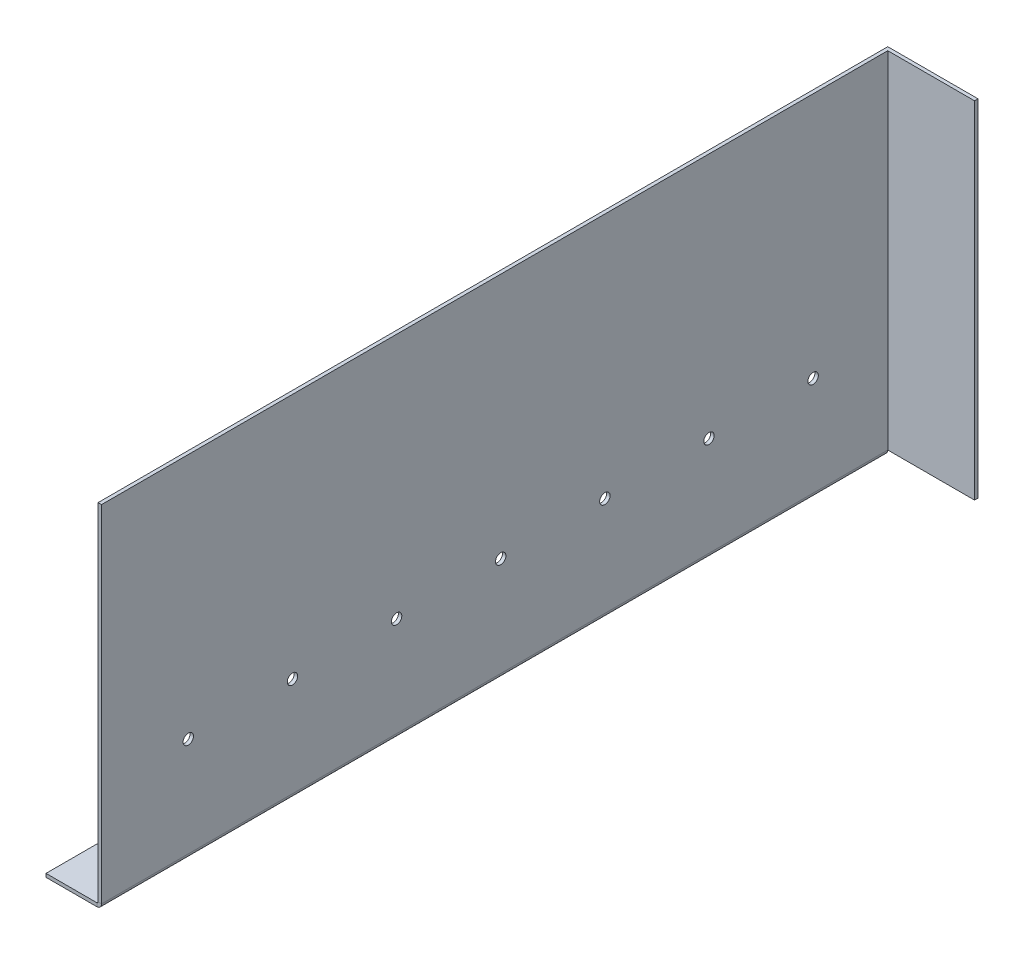
ISO-10303-21;
HEADER;
FILE_DESCRIPTION(('STEP AP214'),'2;1');
FILE_NAME('part.step','',(''),(''),'','','');
FILE_SCHEMA(('AUTOMOTIVE_DESIGN { 1 0 10303 214 1 1 1 1 }'));
ENDSEC;
DATA;
#1=APPLICATION_CONTEXT('core data for automotive mechanical design processes');
#2=APPLICATION_PROTOCOL_DEFINITION('international standard','automotive_design',2000,#1);
#3=PRODUCT_CONTEXT('',#1,'mechanical');
#4=PRODUCT('Part','Part','',(#3));
#5=PRODUCT_RELATED_PRODUCT_CATEGORY('part','',(#4));
#6=PRODUCT_DEFINITION_FORMATION('','',#4);
#7=PRODUCT_DEFINITION_CONTEXT('part definition',#1,'design');
#8=PRODUCT_DEFINITION('design','',#6,#7);
#9=PRODUCT_DEFINITION_SHAPE('','',#8);
#10=(LENGTH_UNIT() NAMED_UNIT(*) SI_UNIT(.MILLI.,.METRE.));
#11=(NAMED_UNIT(*) PLANE_ANGLE_UNIT() SI_UNIT($,.RADIAN.));
#12=(NAMED_UNIT(*) SI_UNIT($,.STERADIAN.) SOLID_ANGLE_UNIT());
#13=UNCERTAINTY_MEASURE_WITH_UNIT(LENGTH_MEASURE(1.E-05),#10,'distance_accuracy_value','');
#14=(GEOMETRIC_REPRESENTATION_CONTEXT(3) GLOBAL_UNCERTAINTY_ASSIGNED_CONTEXT((#13)) GLOBAL_UNIT_ASSIGNED_CONTEXT((#10,
#11,#12)) REPRESENTATION_CONTEXT('',''));
#15=CARTESIAN_POINT('',(0.,0.,0.));
#16=DIRECTION('',(0.,0.,1.));
#17=DIRECTION('',(1.,0.,0.));
#18=AXIS2_PLACEMENT_3D('',#15,#16,#17);
#19=CARTESIAN_POINT('',(29.2634,0.7366,550.));
#20=DIRECTION('',(0.,0.,-1.));
#21=DIRECTION('',(-1.,0.,0.));
#22=AXIS2_PLACEMENT_3D('',#19,#20,#21);
#23=CYLINDRICAL_SURFACE('',#22,0.7366);
#24=DIRECTION('',(0.,0.,-1.));
#25=VECTOR('',#24,1.);
#26=CARTESIAN_POINT('',(30.,0.7366,550.));
#27=LINE('',#26,#25);
#28=CARTESIAN_POINT('',(30.,0.7366,550.));
#29=VERTEX_POINT('',#28);
#30=CARTESIAN_POINT('',(30.,0.736600000000004,97.));
#31=VERTEX_POINT('',#30);
#32=EDGE_CURVE('E159',#29,#31,#27,.T.);
#33=ORIENTED_EDGE('',*,*,#32,.T.);
#34=CARTESIAN_POINT('',(29.2634,0.7366,97.));
#35=DIRECTION('',(0.,0.,1.));
#36=DIRECTION('',(1.,0.,0.));
#37=AXIS2_PLACEMENT_3D('',#34,#35,#36);
#38=CIRCLE('',#37,0.7366);
#39=CARTESIAN_POINT('',(29.2634,0.,97.));
#40=VERTEX_POINT('',#39);
#41=EDGE_CURVE('E143',#40,#31,#38,.T.);
#42=ORIENTED_EDGE('',*,*,#41,.F.);
#43=DIRECTION('',(0.,0.,-1.));
#44=VECTOR('',#43,1.);
#45=CARTESIAN_POINT('',(29.2634,0.,550.));
#46=LINE('',#45,#44);
#47=CARTESIAN_POINT('',(29.2634,0.,550.));
#48=VERTEX_POINT('',#47);
#49=EDGE_CURVE('E151',#48,#40,#46,.T.);
#50=ORIENTED_EDGE('',*,*,#49,.F.);
#51=CARTESIAN_POINT('',(29.2634,0.7366,550.));
#52=DIRECTION('',(0.,0.,-1.));
#53=DIRECTION('',(-1.,0.,0.));
#54=AXIS2_PLACEMENT_3D('',#51,#52,#53);
#55=CIRCLE('',#54,0.7366);
#56=EDGE_CURVE('E206',#48,#29,#55,.F.);
#57=ORIENTED_EDGE('',*,*,#56,.T.);
#58=EDGE_LOOP('',(#33,#42,#50,#57));
#59=FACE_BOUND('',#58,.T.);
#60=ADVANCED_FACE('F39',(#59),#23,.F.);
#61=CARTESIAN_POINT('',(0.,0.,550.));
#62=DIRECTION('',(0.,1.,0.));
#63=DIRECTION('',(0.,0.,1.));
#64=AXIS2_PLACEMENT_3D('',#61,#62,#63);
#65=PLANE('',#64);
#66=ORIENTED_EDGE('',*,*,#49,.T.);
#67=DIRECTION('',(1.,0.,0.));
#68=VECTOR('',#67,1.);
#69=CARTESIAN_POINT('',(14.6317,0.,97.));
#70=LINE('',#69,#68);
#71=CARTESIAN_POINT('',(0.,0.,97.));
#72=VERTEX_POINT('',#71);
#73=EDGE_CURVE('E134',#72,#40,#70,.T.);
#74=ORIENTED_EDGE('',*,*,#73,.F.);
#75=DIRECTION('',(0.,0.,-1.));
#76=VECTOR('',#75,1.);
#77=CARTESIAN_POINT('',(0.,0.,550.));
#78=LINE('',#77,#76);
#79=CARTESIAN_POINT('',(0.,0.,550.));
#80=VERTEX_POINT('',#79);
#81=EDGE_CURVE('E142',#80,#72,#78,.T.);
#82=ORIENTED_EDGE('',*,*,#81,.F.);
#83=DIRECTION('',(1.,0.,0.));
#84=VECTOR('',#83,1.);
#85=CARTESIAN_POINT('',(0.,0.,550.));
#86=LINE('',#85,#84);
#87=EDGE_CURVE('E209',#80,#48,#86,.T.);
#88=ORIENTED_EDGE('',*,*,#87,.T.);
#89=EDGE_LOOP('',(#66,#74,#82,#88));
#90=FACE_BOUND('',#89,.T.);
#91=ADVANCED_FACE('F303',(#90),#65,.T.);
#92=CARTESIAN_POINT('',(0.,-2.,550.));
#93=DIRECTION('',(-1.,0.,0.));
#94=DIRECTION('',(0.,0.,1.));
#95=AXIS2_PLACEMENT_3D('',#92,#93,#94);
#96=PLANE('',#95);
#97=ORIENTED_EDGE('',*,*,#81,.T.);
#98=DIRECTION('',(0.,1.,0.));
#99=VECTOR('',#98,1.);
#100=CARTESIAN_POINT('',(0.,-2.,97.));
#101=LINE('',#100,#99);
#102=CARTESIAN_POINT('',(0.,-2.,97.));
#103=VERTEX_POINT('',#102);
#104=EDGE_CURVE('E126',#72,#103,#101,.F.);
#105=ORIENTED_EDGE('',*,*,#104,.T.);
#106=DIRECTION('',(0.,0.,-1.));
#107=VECTOR('',#106,1.);
#108=CARTESIAN_POINT('',(0.,-2.,550.));
#109=LINE('',#108,#107);
#110=CARTESIAN_POINT('',(0.,-2.,550.));
#111=VERTEX_POINT('',#110);
#112=EDGE_CURVE('E140',#111,#103,#109,.T.);
#113=ORIENTED_EDGE('',*,*,#112,.F.);
#114=DIRECTION('',(0.,1.,0.));
#115=VECTOR('',#114,1.);
#116=CARTESIAN_POINT('',(0.,-2.,550.));
#117=LINE('',#116,#115);
#118=EDGE_CURVE('E212',#111,#80,#117,.T.);
#119=ORIENTED_EDGE('',*,*,#118,.T.);
#120=EDGE_LOOP('',(#97,#105,#113,#119));
#121=FACE_BOUND('',#120,.T.);
#122=ADVANCED_FACE('F138',(#121),#96,.T.);
#123=CARTESIAN_POINT('',(0.,-2.,550.));
#124=DIRECTION('',(0.,1.,0.));
#125=DIRECTION('',(0.,0.,1.));
#126=AXIS2_PLACEMENT_3D('',#123,#124,#125);
#127=PLANE('',#126);
#128=DIRECTION('',(1.,0.,0.));
#129=VECTOR('',#128,1.);
#130=CARTESIAN_POINT('',(0.,-2.,97.));
#131=LINE('',#130,#129);
#132=CARTESIAN_POINT('',(29.2634,-2.,97.));
#133=VERTEX_POINT('',#132);
#134=EDGE_CURVE('E123',#103,#133,#131,.T.);
#135=ORIENTED_EDGE('',*,*,#134,.T.);
#136=DIRECTION('',(0.,0.,-1.));
#137=VECTOR('',#136,1.);
#138=CARTESIAN_POINT('',(29.2634,-2.,550.));
#139=LINE('',#138,#137);
#140=CARTESIAN_POINT('',(29.2634,-2.,550.));
#141=VERTEX_POINT('',#140);
#142=EDGE_CURVE('E149',#141,#133,#139,.T.);
#143=ORIENTED_EDGE('',*,*,#142,.F.);
#144=DIRECTION('',(1.,0.,0.));
#145=VECTOR('',#144,1.);
#146=CARTESIAN_POINT('',(0.,-2.,550.));
#147=LINE('',#146,#145);
#148=EDGE_CURVE('E147',#111,#141,#147,.T.);
#149=ORIENTED_EDGE('',*,*,#148,.F.);
#150=ORIENTED_EDGE('',*,*,#112,.T.);
#151=EDGE_LOOP('',(#135,#143,#149,#150));
#152=FACE_BOUND('',#151,.T.);
#153=ADVANCED_FACE('F145',(#152),#127,.F.);
#154=CARTESIAN_POINT('',(29.2634,0.7366,550.));
#155=DIRECTION('',(0.,0.,-1.));
#156=DIRECTION('',(-1.,0.,0.));
#157=AXIS2_PLACEMENT_3D('',#154,#155,#156);
#158=CYLINDRICAL_SURFACE('',#157,2.7366);
#159=CARTESIAN_POINT('',(29.2634,0.7366,97.));
#160=DIRECTION('',(0.,0.,-1.));
#161=DIRECTION('',(-1.,0.,0.));
#162=AXIS2_PLACEMENT_3D('',#159,#160,#161);
#163=CIRCLE('',#162,2.7366);
#164=CARTESIAN_POINT('',(32.,0.736599999999453,97.));
#165=VERTEX_POINT('',#164);
#166=EDGE_CURVE('E333',#133,#165,#163,.F.);
#167=ORIENTED_EDGE('',*,*,#166,.T.);
#168=DIRECTION('',(0.,0.,-1.));
#169=VECTOR('',#168,1.);
#170=CARTESIAN_POINT('',(32.,0.7366,550.));
#171=LINE('',#170,#169);
#172=CARTESIAN_POINT('',(32.,0.7366,550.));
#173=VERTEX_POINT('',#172);
#174=EDGE_CURVE('E153',#173,#165,#171,.T.);
#175=ORIENTED_EDGE('',*,*,#174,.F.);
#176=CARTESIAN_POINT('',(29.2634,0.7366,550.));
#177=DIRECTION('',(0.,0.,1.));
#178=DIRECTION('',(1.,0.,0.));
#179=AXIS2_PLACEMENT_3D('',#176,#177,#178);
#180=CIRCLE('',#179,2.7366);
#181=EDGE_CURVE('E215',#141,#173,#180,.T.);
#182=ORIENTED_EDGE('',*,*,#181,.F.);
#183=ORIENTED_EDGE('',*,*,#142,.T.);
#184=EDGE_LOOP('',(#167,#175,#182,#183));
#185=FACE_BOUND('',#184,.T.);
#186=ADVANCED_FACE('F276',(#185),#158,.T.);
#187=CARTESIAN_POINT('',(32.,0.,550.));
#188=DIRECTION('',(-1.,0.,0.));
#189=DIRECTION('',(0.,0.,1.));
#190=AXIS2_PLACEMENT_3D('',#187,#188,#189);
#191=PLANE('',#190);
#192=CARTESIAN_POINT('',(32.,58.,140.));
#193=DIRECTION('',(1.,0.,0.));
#194=DIRECTION('',(0.,0.,-1.));
#195=AXIS2_PLACEMENT_3D('',#192,#193,#194);
#196=CIRCLE('',#195,2.99999999999999);
#197=CARTESIAN_POINT('',(32.,58.,137.));
#198=VERTEX_POINT('',#197);
#199=EDGE_CURVE('E201',#198,#198,#196,.T.);
#200=ORIENTED_EDGE('',*,*,#199,.F.);
#201=EDGE_LOOP('',(#200));
#202=FACE_BOUND('',#201,.T.);
#203=CARTESIAN_POINT('',(32.,58.,200.));
#204=DIRECTION('',(1.,0.,0.));
#205=DIRECTION('',(0.,0.,-1.));
#206=AXIS2_PLACEMENT_3D('',#203,#204,#205);
#207=CIRCLE('',#206,2.99999999999999);
#208=CARTESIAN_POINT('',(32.,58.,197.));
#209=VERTEX_POINT('',#208);
#210=EDGE_CURVE('E264',#209,#209,#207,.T.);
#211=ORIENTED_EDGE('',*,*,#210,.F.);
#212=EDGE_LOOP('',(#211));
#213=FACE_BOUND('',#212,.T.);
#214=CARTESIAN_POINT('',(32.,58.,260.));
#215=DIRECTION('',(1.,0.,0.));
#216=DIRECTION('',(0.,0.,-1.));
#217=AXIS2_PLACEMENT_3D('',#214,#215,#216);
#218=CIRCLE('',#217,2.99999999999999);
#219=CARTESIAN_POINT('',(32.,58.,257.));
#220=VERTEX_POINT('',#219);
#221=EDGE_CURVE('E262',#220,#220,#218,.T.);
#222=ORIENTED_EDGE('',*,*,#221,.F.);
#223=EDGE_LOOP('',(#222));
#224=FACE_BOUND('',#223,.T.);
#225=CARTESIAN_POINT('',(32.,58.,320.));
#226=DIRECTION('',(1.,0.,0.));
#227=DIRECTION('',(0.,0.,-1.));
#228=AXIS2_PLACEMENT_3D('',#225,#226,#227);
#229=CIRCLE('',#228,2.99999999999999);
#230=CARTESIAN_POINT('',(32.,58.,317.));
#231=VERTEX_POINT('',#230);
#232=EDGE_CURVE('E259',#231,#231,#229,.T.);
#233=ORIENTED_EDGE('',*,*,#232,.F.);
#234=EDGE_LOOP('',(#233));
#235=FACE_BOUND('',#234,.T.);
#236=CARTESIAN_POINT('',(32.,58.,380.));
#237=DIRECTION('',(1.,0.,0.));
#238=DIRECTION('',(0.,0.,-1.));
#239=AXIS2_PLACEMENT_3D('',#236,#237,#238);
#240=CIRCLE('',#239,2.99999999999999);
#241=CARTESIAN_POINT('',(32.,58.,377.));
#242=VERTEX_POINT('',#241);
#243=EDGE_CURVE('E256',#242,#242,#240,.T.);
#244=ORIENTED_EDGE('',*,*,#243,.F.);
#245=EDGE_LOOP('',(#244));
#246=FACE_BOUND('',#245,.T.);
#247=CARTESIAN_POINT('',(32.,58.,440.));
#248=DIRECTION('',(1.,0.,0.));
#249=DIRECTION('',(0.,0.,-1.));
#250=AXIS2_PLACEMENT_3D('',#247,#248,#249);
#251=CIRCLE('',#250,2.99999999999999);
#252=CARTESIAN_POINT('',(32.,58.,437.));
#253=VERTEX_POINT('',#252);
#254=EDGE_CURVE('E253',#253,#253,#251,.T.);
#255=ORIENTED_EDGE('',*,*,#254,.F.);
#256=EDGE_LOOP('',(#255));
#257=FACE_BOUND('',#256,.T.);
#258=CARTESIAN_POINT('',(32.,58.,500.));
#259=DIRECTION('',(1.,0.,0.));
#260=DIRECTION('',(0.,0.,-1.));
#261=AXIS2_PLACEMENT_3D('',#258,#259,#260);
#262=CIRCLE('',#261,2.99999999999999);
#263=CARTESIAN_POINT('',(32.,58.,497.));
#264=VERTEX_POINT('',#263);
#265=EDGE_CURVE('E174',#264,#264,#262,.T.);
#266=ORIENTED_EDGE('',*,*,#265,.F.);
#267=EDGE_LOOP('',(#266));
#268=FACE_BOUND('',#267,.T.);
#269=DIRECTION('',(0.,-1.,0.));
#270=VECTOR('',#269,1.);
#271=CARTESIAN_POINT('',(32.,200.,97.));
#272=LINE('',#271,#270);
#273=CARTESIAN_POINT('',(32.,200.,97.));
#274=VERTEX_POINT('',#273);
#275=EDGE_CURVE('E54',#274,#165,#272,.T.);
#276=ORIENTED_EDGE('',*,*,#275,.F.);
#277=DIRECTION('',(0.,0.,-1.));
#278=VECTOR('',#277,1.);
#279=CARTESIAN_POINT('',(32.,200.,550.));
#280=LINE('',#279,#278);
#281=CARTESIAN_POINT('',(32.,200.,550.));
#282=VERTEX_POINT('',#281);
#283=EDGE_CURVE('E165',#282,#274,#280,.T.);
#284=ORIENTED_EDGE('',*,*,#283,.F.);
#285=DIRECTION('',(0.,1.,0.));
#286=VECTOR('',#285,1.);
#287=CARTESIAN_POINT('',(32.,0.,550.));
#288=LINE('',#287,#286);
#289=EDGE_CURVE('E190',#173,#282,#288,.T.);
#290=ORIENTED_EDGE('',*,*,#289,.F.);
#291=ORIENTED_EDGE('',*,*,#174,.T.);
#292=EDGE_LOOP('',(#276,#284,#290,#291));
#293=FACE_BOUND('',#292,.T.);
#294=ADVANCED_FACE('F217',(#202,#213,#224,#235,#246,#257,#268,#293),#191,.F.);
#295=CARTESIAN_POINT('',(32.,200.,95.));
#296=DIRECTION('',(0.,0.,1.));
#297=DIRECTION('',(0.,-1.,0.));
#298=AXIS2_PLACEMENT_3D('',#295,#296,#297);
#299=PLANE('',#298);
#300=DIRECTION('',(-1.,0.,0.));
#301=VECTOR('',#300,1.);
#302=CARTESIAN_POINT('',(32.,200.,95.));
#303=LINE('',#302,#301);
#304=CARTESIAN_POINT('',(82.,200.,95.));
#305=VERTEX_POINT('',#304);
#306=CARTESIAN_POINT('',(30.,200.,95.));
#307=VERTEX_POINT('',#306);
#308=EDGE_CURVE('E242',#305,#307,#303,.T.);
#309=ORIENTED_EDGE('',*,*,#308,.F.);
#310=DIRECTION('',(0.,1.,0.));
#311=VECTOR('',#310,1.);
#312=CARTESIAN_POINT('',(82.,200.,95.));
#313=LINE('',#312,#311);
#314=CARTESIAN_POINT('',(82.,0.736600000000001,95.));
#315=VERTEX_POINT('',#314);
#316=EDGE_CURVE('E597',#315,#305,#313,.T.);
#317=ORIENTED_EDGE('',*,*,#316,.F.);
#318=DIRECTION('',(-1.,0.,0.));
#319=VECTOR('',#318,1.);
#320=CARTESIAN_POINT('',(82.,0.736600000000001,95.));
#321=LINE('',#320,#319);
#322=CARTESIAN_POINT('',(32.,0.736600000000001,95.));
#323=VERTEX_POINT('',#322);
#324=EDGE_CURVE('E240',#315,#323,#321,.T.);
#325=ORIENTED_EDGE('',*,*,#324,.T.);
#326=DIRECTION('',(-1.,0.,0.));
#327=VECTOR('',#326,1.);
#328=CARTESIAN_POINT('',(32.,0.7366,95.));
#329=LINE('',#328,#327);
#330=CARTESIAN_POINT('',(30.,0.736600000000004,95.));
#331=VERTEX_POINT('',#330);
#332=EDGE_CURVE('E11',#323,#331,#329,.T.);
#333=ORIENTED_EDGE('',*,*,#332,.T.);
#334=DIRECTION('',(0.,1.,0.));
#335=VECTOR('',#334,1.);
#336=CARTESIAN_POINT('',(30.,0.,95.));
#337=LINE('',#336,#335);
#338=EDGE_CURVE('E249',#331,#307,#337,.T.);
#339=ORIENTED_EDGE('',*,*,#338,.T.);
#340=EDGE_LOOP('',(#309,#317,#325,#333,#339));
#341=FACE_BOUND('',#340,.T.);
#342=ADVANCED_FACE('F275',(#341),#299,.F.);
#343=CARTESIAN_POINT('',(30.,0.7366,550.));
#344=DIRECTION('',(0.,0.,1.));
#345=DIRECTION('',(1.,0.,0.));
#346=AXIS2_PLACEMENT_3D('',#343,#344,#345);
#347=PLANE('',#346);
#348=DIRECTION('',(1.,0.,0.));
#349=VECTOR('',#348,1.);
#350=CARTESIAN_POINT('',(30.,0.7366,550.));
#351=LINE('',#350,#349);
#352=EDGE_CURVE('E47',#29,#173,#351,.T.);
#353=ORIENTED_EDGE('',*,*,#352,.F.);
#354=ORIENTED_EDGE('',*,*,#56,.F.);
#355=DIRECTION('',(0.,1.,0.));
#356=VECTOR('',#355,1.);
#357=CARTESIAN_POINT('',(29.2634,-2.,550.));
#358=LINE('',#357,#356);
#359=EDGE_CURVE('E167',#141,#48,#358,.T.);
#360=ORIENTED_EDGE('',*,*,#359,.F.);
#361=ORIENTED_EDGE('',*,*,#181,.T.);
#362=EDGE_LOOP('',(#353,#354,#360,#361));
#363=FACE_BOUND('',#362,.T.);
#364=ADVANCED_FACE('F41',(#363),#347,.T.);
#365=CARTESIAN_POINT('',(29.2634,-2.,550.));
#366=DIRECTION('',(0.,0.,1.));
#367=DIRECTION('',(1.,0.,0.));
#368=AXIS2_PLACEMENT_3D('',#365,#366,#367);
#369=PLANE('',#368);
#370=DIRECTION('',(0.,1.,0.));
#371=VECTOR('',#370,1.);
#372=CARTESIAN_POINT('',(30.,0.,550.));
#373=LINE('',#372,#371);
#374=CARTESIAN_POINT('',(30.,200.,550.));
#375=VERTEX_POINT('',#374);
#376=EDGE_CURVE('E198',#29,#375,#373,.T.);
#377=ORIENTED_EDGE('',*,*,#376,.F.);
#378=ORIENTED_EDGE('',*,*,#352,.T.);
#379=ORIENTED_EDGE('',*,*,#289,.T.);
#380=DIRECTION('',(1.,0.,0.));
#381=VECTOR('',#380,1.);
#382=CARTESIAN_POINT('',(30.,200.,550.));
#383=LINE('',#382,#381);
#384=EDGE_CURVE('E193',#375,#282,#383,.T.);
#385=ORIENTED_EDGE('',*,*,#384,.F.);
#386=EDGE_LOOP('',(#377,#378,#379,#385));
#387=FACE_BOUND('',#386,.T.);
#388=ADVANCED_FACE('F320',(#387),#369,.T.);
#389=CARTESIAN_POINT('',(30.,200.,550.));
#390=DIRECTION('',(0.,1.,0.));
#391=DIRECTION('',(0.,0.,1.));
#392=AXIS2_PLACEMENT_3D('',#389,#390,#391);
#393=PLANE('',#392);
#394=ORIENTED_EDGE('',*,*,#308,.T.);
#395=DIRECTION('',(0.,0.,-1.));
#396=VECTOR('',#395,1.);
#397=CARTESIAN_POINT('',(30.,200.,550.));
#398=LINE('',#397,#396);
#399=EDGE_CURVE('E162',#375,#307,#398,.T.);
#400=ORIENTED_EDGE('',*,*,#399,.F.);
#401=ORIENTED_EDGE('',*,*,#384,.T.);
#402=ORIENTED_EDGE('',*,*,#283,.T.);
#403=DIRECTION('',(-1.,0.,0.));
#404=VECTOR('',#403,1.);
#405=CARTESIAN_POINT('',(82.,200.,97.));
#406=LINE('',#405,#404);
#407=CARTESIAN_POINT('',(82.,200.,97.));
#408=VERTEX_POINT('',#407);
#409=EDGE_CURVE('E230',#408,#274,#406,.T.);
#410=ORIENTED_EDGE('',*,*,#409,.F.);
#411=DIRECTION('',(0.,0.,1.));
#412=VECTOR('',#411,1.);
#413=CARTESIAN_POINT('',(82.,200.,95.));
#414=LINE('',#413,#412);
#415=EDGE_CURVE('E599',#305,#408,#414,.T.);
#416=ORIENTED_EDGE('',*,*,#415,.F.);
#417=EDGE_LOOP('',(#394,#400,#401,#402,#410,#416));
#418=FACE_BOUND('',#417,.T.);
#419=ADVANCED_FACE('F317',(#418),#393,.T.);
#420=CARTESIAN_POINT('',(30.,0.,550.));
#421=DIRECTION('',(-1.,0.,0.));
#422=DIRECTION('',(0.,0.,1.));
#423=AXIS2_PLACEMENT_3D('',#420,#421,#422);
#424=PLANE('',#423);
#425=ORIENTED_EDGE('',*,*,#338,.F.);
#426=DIRECTION('',(0.,0.,-1.));
#427=VECTOR('',#426,1.);
#428=CARTESIAN_POINT('',(30.,0.736599999999853,550.));
#429=LINE('',#428,#427);
#430=EDGE_CURVE('E609',#31,#331,#429,.T.);
#431=ORIENTED_EDGE('',*,*,#430,.F.);
#432=ORIENTED_EDGE('',*,*,#32,.F.);
#433=ORIENTED_EDGE('',*,*,#376,.T.);
#434=ORIENTED_EDGE('',*,*,#399,.T.);
#435=EDGE_LOOP('',(#425,#431,#432,#433,#434));
#436=FACE_BOUND('',#435,.T.);
#437=CARTESIAN_POINT('',(30.,58.,500.));
#438=DIRECTION('',(-1.,0.,0.));
#439=DIRECTION('',(0.,0.,1.));
#440=AXIS2_PLACEMENT_3D('',#437,#438,#439);
#441=CIRCLE('',#440,2.99999999999999);
#442=CARTESIAN_POINT('',(30.,58.,503.));
#443=VERTEX_POINT('',#442);
#444=EDGE_CURVE('E188',#443,#443,#441,.T.);
#445=ORIENTED_EDGE('',*,*,#444,.F.);
#446=EDGE_LOOP('',(#445));
#447=FACE_BOUND('',#446,.T.);
#448=CARTESIAN_POINT('',(30.,58.,440.));
#449=DIRECTION('',(-1.,0.,0.));
#450=DIRECTION('',(0.,0.,1.));
#451=AXIS2_PLACEMENT_3D('',#448,#449,#450);
#452=CIRCLE('',#451,2.99999999999999);
#453=CARTESIAN_POINT('',(30.,58.,443.));
#454=VERTEX_POINT('',#453);
#455=EDGE_CURVE('E186',#454,#454,#452,.T.);
#456=ORIENTED_EDGE('',*,*,#455,.F.);
#457=EDGE_LOOP('',(#456));
#458=FACE_BOUND('',#457,.T.);
#459=CARTESIAN_POINT('',(30.,58.,380.));
#460=DIRECTION('',(-1.,0.,0.));
#461=DIRECTION('',(0.,0.,1.));
#462=AXIS2_PLACEMENT_3D('',#459,#460,#461);
#463=CIRCLE('',#462,2.99999999999999);
#464=CARTESIAN_POINT('',(30.,58.,383.));
#465=VERTEX_POINT('',#464);
#466=EDGE_CURVE('E183',#465,#465,#463,.T.);
#467=ORIENTED_EDGE('',*,*,#466,.F.);
#468=EDGE_LOOP('',(#467));
#469=FACE_BOUND('',#468,.T.);
#470=CARTESIAN_POINT('',(30.,58.,320.));
#471=DIRECTION('',(-1.,0.,0.));
#472=DIRECTION('',(0.,0.,1.));
#473=AXIS2_PLACEMENT_3D('',#470,#471,#472);
#474=CIRCLE('',#473,2.99999999999999);
#475=CARTESIAN_POINT('',(30.,58.,323.));
#476=VERTEX_POINT('',#475);
#477=EDGE_CURVE('E180',#476,#476,#474,.T.);
#478=ORIENTED_EDGE('',*,*,#477,.F.);
#479=EDGE_LOOP('',(#478));
#480=FACE_BOUND('',#479,.T.);
#481=CARTESIAN_POINT('',(30.,58.,260.));
#482=DIRECTION('',(-1.,0.,0.));
#483=DIRECTION('',(0.,0.,1.));
#484=AXIS2_PLACEMENT_3D('',#481,#482,#483);
#485=CIRCLE('',#484,2.99999999999999);
#486=CARTESIAN_POINT('',(30.,58.,263.));
#487=VERTEX_POINT('',#486);
#488=EDGE_CURVE('E177',#487,#487,#485,.T.);
#489=ORIENTED_EDGE('',*,*,#488,.F.);
#490=EDGE_LOOP('',(#489));
#491=FACE_BOUND('',#490,.T.);
#492=CARTESIAN_POINT('',(30.,58.,200.));
#493=DIRECTION('',(-1.,0.,0.));
#494=DIRECTION('',(0.,0.,1.));
#495=AXIS2_PLACEMENT_3D('',#492,#493,#494);
#496=CIRCLE('',#495,2.99999999999999);
#497=CARTESIAN_POINT('',(30.,58.,203.));
#498=VERTEX_POINT('',#497);
#499=EDGE_CURVE('E173',#498,#498,#496,.T.);
#500=ORIENTED_EDGE('',*,*,#499,.F.);
#501=EDGE_LOOP('',(#500));
#502=FACE_BOUND('',#501,.T.);
#503=CARTESIAN_POINT('',(30.,58.,140.));
#504=DIRECTION('',(-1.,0.,0.));
#505=DIRECTION('',(0.,0.,1.));
#506=AXIS2_PLACEMENT_3D('',#503,#504,#505);
#507=CIRCLE('',#506,2.99999999999999);
#508=CARTESIAN_POINT('',(30.,58.,143.));
#509=VERTEX_POINT('',#508);
#510=EDGE_CURVE('E170',#509,#509,#507,.T.);
#511=ORIENTED_EDGE('',*,*,#510,.F.);
#512=EDGE_LOOP('',(#511));
#513=FACE_BOUND('',#512,.T.);
#514=ADVANCED_FACE('F313',(#436,#447,#458,#469,#480,#491,#502,#513),#424,.T.);
#515=CARTESIAN_POINT('',(29.2634,0.7366,550.));
#516=DIRECTION('',(0.,0.,-1.));
#517=DIRECTION('',(-1.,0.,0.));
#518=AXIS2_PLACEMENT_3D('',#515,#516,#517);
#519=PLANE('',#518);
#520=ORIENTED_EDGE('',*,*,#148,.T.);
#521=ORIENTED_EDGE('',*,*,#359,.T.);
#522=ORIENTED_EDGE('',*,*,#87,.F.);
#523=ORIENTED_EDGE('',*,*,#118,.F.);
#524=EDGE_LOOP('',(#520,#521,#522,#523));
#525=FACE_BOUND('',#524,.T.);
#526=ADVANCED_FACE('F316',(#525),#519,.F.);
#527=CARTESIAN_POINT('',(22.,58.,140.));
#528=DIRECTION('',(1.,0.,0.));
#529=DIRECTION('',(0.,0.,-1.));
#530=AXIS2_PLACEMENT_3D('',#527,#528,#529);
#531=CYLINDRICAL_SURFACE('',#530,2.99999999999999);
#532=ORIENTED_EDGE('',*,*,#510,.T.);
#533=EDGE_LOOP('',(#532));
#534=FACE_BOUND('',#533,.T.);
#535=ORIENTED_EDGE('',*,*,#199,.T.);
#536=EDGE_LOOP('',(#535));
#537=FACE_BOUND('',#536,.T.);
#538=ADVANCED_FACE('F271',(#534,#537),#531,.F.);
#539=CARTESIAN_POINT('',(22.,58.,200.));
#540=DIRECTION('',(1.,0.,0.));
#541=DIRECTION('',(0.,0.,-1.));
#542=AXIS2_PLACEMENT_3D('',#539,#540,#541);
#543=CYLINDRICAL_SURFACE('',#542,2.99999999999999);
#544=ORIENTED_EDGE('',*,*,#499,.T.);
#545=EDGE_LOOP('',(#544));
#546=FACE_BOUND('',#545,.T.);
#547=ORIENTED_EDGE('',*,*,#210,.T.);
#548=EDGE_LOOP('',(#547));
#549=FACE_BOUND('',#548,.T.);
#550=ADVANCED_FACE('F517',(#546,#549),#543,.F.);
#551=CARTESIAN_POINT('',(22.,58.,260.));
#552=DIRECTION('',(1.,0.,0.));
#553=DIRECTION('',(0.,0.,-1.));
#554=AXIS2_PLACEMENT_3D('',#551,#552,#553);
#555=CYLINDRICAL_SURFACE('',#554,2.99999999999999);
#556=ORIENTED_EDGE('',*,*,#488,.T.);
#557=EDGE_LOOP('',(#556));
#558=FACE_BOUND('',#557,.T.);
#559=ORIENTED_EDGE('',*,*,#221,.T.);
#560=EDGE_LOOP('',(#559));
#561=FACE_BOUND('',#560,.T.);
#562=ADVANCED_FACE('F506',(#558,#561),#555,.F.);
#563=CARTESIAN_POINT('',(22.,58.,320.));
#564=DIRECTION('',(1.,0.,0.));
#565=DIRECTION('',(0.,0.,-1.));
#566=AXIS2_PLACEMENT_3D('',#563,#564,#565);
#567=CYLINDRICAL_SURFACE('',#566,2.99999999999999);
#568=ORIENTED_EDGE('',*,*,#477,.T.);
#569=EDGE_LOOP('',(#568));
#570=FACE_BOUND('',#569,.T.);
#571=ORIENTED_EDGE('',*,*,#232,.T.);
#572=EDGE_LOOP('',(#571));
#573=FACE_BOUND('',#572,.T.);
#574=ADVANCED_FACE('F495',(#570,#573),#567,.F.);
#575=CARTESIAN_POINT('',(22.,58.,380.));
#576=DIRECTION('',(1.,0.,0.));
#577=DIRECTION('',(0.,0.,-1.));
#578=AXIS2_PLACEMENT_3D('',#575,#576,#577);
#579=CYLINDRICAL_SURFACE('',#578,2.99999999999999);
#580=ORIENTED_EDGE('',*,*,#466,.T.);
#581=EDGE_LOOP('',(#580));
#582=FACE_BOUND('',#581,.T.);
#583=ORIENTED_EDGE('',*,*,#243,.T.);
#584=EDGE_LOOP('',(#583));
#585=FACE_BOUND('',#584,.T.);
#586=ADVANCED_FACE('F298',(#582,#585),#579,.F.);
#587=CARTESIAN_POINT('',(22.,58.,440.));
#588=DIRECTION('',(1.,0.,0.));
#589=DIRECTION('',(0.,0.,-1.));
#590=AXIS2_PLACEMENT_3D('',#587,#588,#589);
#591=CYLINDRICAL_SURFACE('',#590,2.99999999999999);
#592=ORIENTED_EDGE('',*,*,#455,.T.);
#593=EDGE_LOOP('',(#592));
#594=FACE_BOUND('',#593,.T.);
#595=ORIENTED_EDGE('',*,*,#254,.T.);
#596=EDGE_LOOP('',(#595));
#597=FACE_BOUND('',#596,.T.);
#598=ADVANCED_FACE('F291',(#594,#597),#591,.F.);
#599=CARTESIAN_POINT('',(22.,58.,500.));
#600=DIRECTION('',(1.,0.,0.));
#601=DIRECTION('',(0.,0.,-1.));
#602=AXIS2_PLACEMENT_3D('',#599,#600,#601);
#603=CYLINDRICAL_SURFACE('',#602,2.99999999999999);
#604=ORIENTED_EDGE('',*,*,#444,.T.);
#605=EDGE_LOOP('',(#604));
#606=FACE_BOUND('',#605,.T.);
#607=ORIENTED_EDGE('',*,*,#265,.T.);
#608=EDGE_LOOP('',(#607));
#609=FACE_BOUND('',#608,.T.);
#610=ADVANCED_FACE('F289',(#606,#609),#603,.F.);
#611=CARTESIAN_POINT('',(82.,200.,97.));
#612=DIRECTION('',(0.,0.,-1.));
#613=DIRECTION('',(0.,1.,0.));
#614=AXIS2_PLACEMENT_3D('',#611,#612,#613);
#615=PLANE('',#614);
#616=ORIENTED_EDGE('',*,*,#275,.T.);
#617=DIRECTION('',(-1.,0.,0.));
#618=VECTOR('',#617,1.);
#619=CARTESIAN_POINT('',(82.,0.7366,97.));
#620=LINE('',#619,#618);
#621=CARTESIAN_POINT('',(82.,0.7366,97.));
#622=VERTEX_POINT('',#621);
#623=EDGE_CURVE('E227',#622,#165,#620,.T.);
#624=ORIENTED_EDGE('',*,*,#623,.F.);
#625=DIRECTION('',(0.,-1.,0.));
#626=VECTOR('',#625,1.);
#627=CARTESIAN_POINT('',(82.,200.,97.));
#628=LINE('',#627,#626);
#629=EDGE_CURVE('E601',#408,#622,#628,.T.);
#630=ORIENTED_EDGE('',*,*,#629,.F.);
#631=ORIENTED_EDGE('',*,*,#409,.T.);
#632=EDGE_LOOP('',(#616,#624,#630,#631));
#633=FACE_BOUND('',#632,.T.);
#634=ADVANCED_FACE('F225',(#633),#615,.F.);
#635=CARTESIAN_POINT('',(82.,0.736600000000001,95.));
#636=DIRECTION('',(0.,1.,0.));
#637=DIRECTION('',(0.,0.,1.));
#638=AXIS2_PLACEMENT_3D('',#635,#636,#637);
#639=PLANE('',#638);
#640=DIRECTION('',(0.,0.,-1.));
#641=VECTOR('',#640,1.);
#642=CARTESIAN_POINT('',(32.,0.736600000000001,95.));
#643=LINE('',#642,#641);
#644=EDGE_CURVE('E231',#165,#323,#643,.T.);
#645=ORIENTED_EDGE('',*,*,#644,.T.);
#646=ORIENTED_EDGE('',*,*,#324,.F.);
#647=DIRECTION('',(0.,0.,-1.));
#648=VECTOR('',#647,1.);
#649=CARTESIAN_POINT('',(82.,0.736600000000001,95.));
#650=LINE('',#649,#648);
#651=EDGE_CURVE('E239',#622,#315,#650,.T.);
#652=ORIENTED_EDGE('',*,*,#651,.F.);
#653=ORIENTED_EDGE('',*,*,#623,.T.);
#654=EDGE_LOOP('',(#645,#646,#652,#653));
#655=FACE_BOUND('',#654,.T.);
#656=ADVANCED_FACE('F236',(#655),#639,.F.);
#657=CARTESIAN_POINT('',(82.,0.,0.));
#658=DIRECTION('',(-1.,0.,0.));
#659=DIRECTION('',(0.,0.,1.));
#660=AXIS2_PLACEMENT_3D('',#657,#658,#659);
#661=PLANE('',#660);
#662=ORIENTED_EDGE('',*,*,#316,.T.);
#663=ORIENTED_EDGE('',*,*,#415,.T.);
#664=ORIENTED_EDGE('',*,*,#629,.T.);
#665=ORIENTED_EDGE('',*,*,#651,.T.);
#666=EDGE_LOOP('',(#662,#663,#664,#665));
#667=FACE_BOUND('',#666,.T.);
#668=ADVANCED_FACE('F397',(#667),#661,.F.);
#669=CARTESIAN_POINT('',(30.,0.736599999999853,96.));
#670=DIRECTION('',(-2.00031326691257E-13,-1.,0.));
#671=DIRECTION('',(0.,0.,-1.));
#672=AXIS2_PLACEMENT_3D('',#669,#670,#671);
#673=PLANE('',#672);
#674=DIRECTION('',(-1.,0.,0.));
#675=VECTOR('',#674,1.);
#676=CARTESIAN_POINT('',(30.,0.736600000000004,97.));
#677=LINE('',#676,#675);
#678=EDGE_CURVE('E232',#31,#165,#677,.F.);
#679=ORIENTED_EDGE('',*,*,#678,.F.);
#680=ORIENTED_EDGE('',*,*,#430,.T.);
#681=ORIENTED_EDGE('',*,*,#332,.F.);
#682=ORIENTED_EDGE('',*,*,#644,.F.);
#683=EDGE_LOOP('',(#679,#680,#681,#682));
#684=FACE_BOUND('',#683,.T.);
#685=ADVANCED_FACE('F404',(#684),#673,.T.);
#686=CARTESIAN_POINT('',(29.2634,0.7366,97.));
#687=DIRECTION('',(0.,0.,-1.));
#688=DIRECTION('',(-1.,0.,0.));
#689=AXIS2_PLACEMENT_3D('',#686,#687,#688);
#690=PLANE('',#689);
#691=ORIENTED_EDGE('',*,*,#41,.T.);
#692=ORIENTED_EDGE('',*,*,#678,.T.);
#693=ORIENTED_EDGE('',*,*,#166,.F.);
#694=DIRECTION('',(0.,1.,0.));
#695=VECTOR('',#694,1.);
#696=CARTESIAN_POINT('',(29.2634,0.,97.));
#697=LINE('',#696,#695);
#698=EDGE_CURVE('E129',#40,#133,#697,.F.);
#699=ORIENTED_EDGE('',*,*,#698,.F.);
#700=EDGE_LOOP('',(#691,#692,#693,#699));
#701=FACE_BOUND('',#700,.T.);
#702=ADVANCED_FACE('F409',(#701),#690,.T.);
#703=CARTESIAN_POINT('',(0.,-2.,97.));
#704=DIRECTION('',(0.,0.,1.));
#705=DIRECTION('',(1.,0.,0.));
#706=AXIS2_PLACEMENT_3D('',#703,#704,#705);
#707=PLANE('',#706);
#708=ORIENTED_EDGE('',*,*,#104,.F.);
#709=ORIENTED_EDGE('',*,*,#73,.T.);
#710=ORIENTED_EDGE('',*,*,#698,.T.);
#711=ORIENTED_EDGE('',*,*,#134,.F.);
#712=EDGE_LOOP('',(#708,#709,#710,#711));
#713=FACE_BOUND('',#712,.T.);
#714=ADVANCED_FACE('F125',(#713),#707,.F.);
#715=CLOSED_SHELL('',(#60,#91,#122,#153,#186,#294,#342,#364,#388,#419,#514,#526,#538,#550,#562,
#574,#586,#598,#610,#634,#656,#668,#685,#702,#714));
#716=MANIFOLD_SOLID_BREP('B2',#715);
#717=ADVANCED_BREP_SHAPE_REPRESENTATION('',(#18,#716),#14);
#718=SHAPE_DEFINITION_REPRESENTATION(#9,#717);
ENDSEC;
END-ISO-10303-21;
